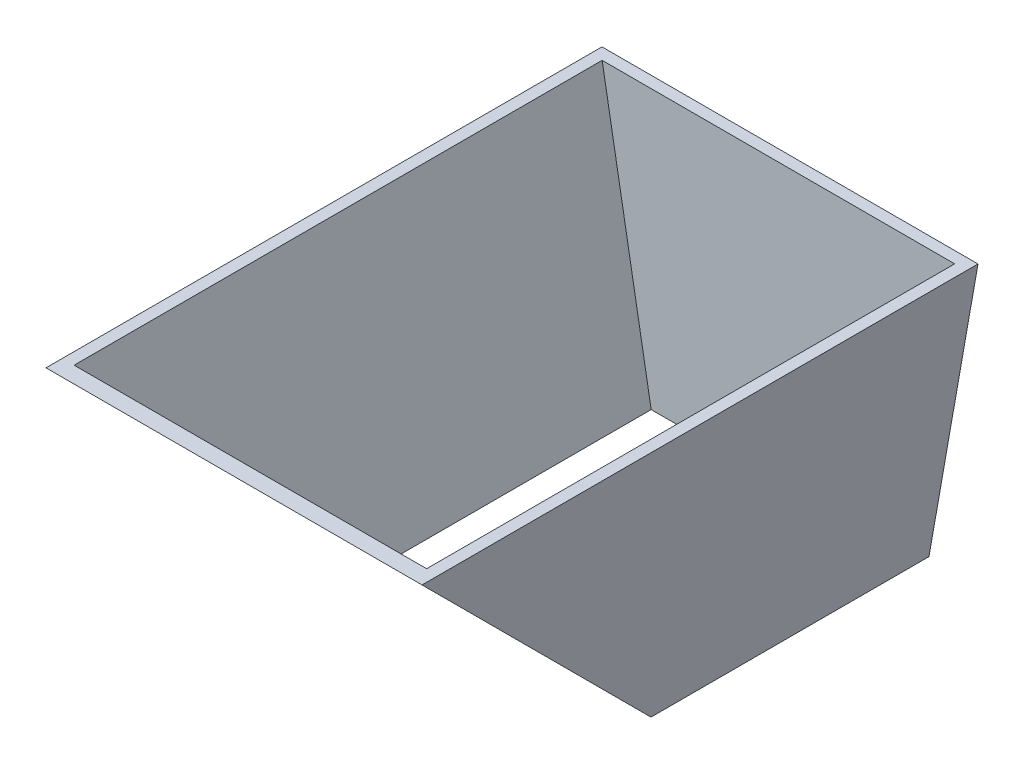
ISO-10303-21;
HEADER;
FILE_DESCRIPTION(('STEP AP214'),'2;1');
FILE_NAME('part.step','',(''),(''),'','','');
FILE_SCHEMA(('AUTOMOTIVE_DESIGN { 1 0 10303 214 1 1 1 1 }'));
ENDSEC;
DATA;
#1=APPLICATION_CONTEXT('core data for automotive mechanical design processes');
#2=APPLICATION_PROTOCOL_DEFINITION('international standard','automotive_design',2000,#1);
#3=PRODUCT_CONTEXT('',#1,'mechanical');
#4=PRODUCT('Part','Part','',(#3));
#5=PRODUCT_RELATED_PRODUCT_CATEGORY('part','',(#4));
#6=PRODUCT_DEFINITION_FORMATION('','',#4);
#7=PRODUCT_DEFINITION_CONTEXT('part definition',#1,'design');
#8=PRODUCT_DEFINITION('design','',#6,#7);
#9=PRODUCT_DEFINITION_SHAPE('','',#8);
#10=(LENGTH_UNIT() NAMED_UNIT(*) SI_UNIT(.MILLI.,.METRE.));
#11=(NAMED_UNIT(*) PLANE_ANGLE_UNIT() SI_UNIT($,.RADIAN.));
#12=(NAMED_UNIT(*) SI_UNIT($,.STERADIAN.) SOLID_ANGLE_UNIT());
#13=UNCERTAINTY_MEASURE_WITH_UNIT(LENGTH_MEASURE(1.E-05),#10,'distance_accuracy_value','');
#14=(GEOMETRIC_REPRESENTATION_CONTEXT(3) GLOBAL_UNCERTAINTY_ASSIGNED_CONTEXT((#13)) GLOBAL_UNIT_ASSIGNED_CONTEXT((#10,
#11,#12)) REPRESENTATION_CONTEXT('',''));
#15=CARTESIAN_POINT('',(0.,0.,0.));
#16=DIRECTION('',(0.,0.,1.));
#17=DIRECTION('',(1.,0.,0.));
#18=AXIS2_PLACEMENT_3D('',#15,#16,#17);
#19=CARTESIAN_POINT('',(-40.579618842508,30.,120.));
#20=DIRECTION('',(0.,-1.,0.));
#21=DIRECTION('',(0.,0.,-1.));
#22=AXIS2_PLACEMENT_3D('',#19,#20,#21);
#23=PLANE('',#22);
#24=DIRECTION('',(-1.,0.,0.));
#25=VECTOR('',#24,1.);
#26=CARTESIAN_POINT('',(-40.579618842508,30.,0.));
#27=LINE('',#26,#25);
#28=CARTESIAN_POINT('',(40.579618842508,30.,0.));
#29=VERTEX_POINT('',#28);
#30=CARTESIAN_POINT('',(-40.579618842508,30.,0.));
#31=VERTEX_POINT('',#30);
#32=EDGE_CURVE('E168',#29,#31,#27,.T.);
#33=ORIENTED_EDGE('',*,*,#32,.T.);
#34=DIRECTION('',(0.,0.,-1.));
#35=VECTOR('',#34,1.);
#36=CARTESIAN_POINT('',(-40.579618842508,30.,120.));
#37=LINE('',#36,#35);
#38=CARTESIAN_POINT('',(-40.579618842508,30.,120.));
#39=VERTEX_POINT('',#38);
#40=EDGE_CURVE('E48',#39,#31,#37,.T.);
#41=ORIENTED_EDGE('',*,*,#40,.F.);
#42=DIRECTION('',(-1.,0.,0.));
#43=VECTOR('',#42,1.);
#44=CARTESIAN_POINT('',(-40.579618842508,30.,120.));
#45=LINE('',#44,#43);
#46=CARTESIAN_POINT('',(40.579618842508,30.,120.));
#47=VERTEX_POINT('',#46);
#48=EDGE_CURVE('E160',#47,#39,#45,.T.);
#49=ORIENTED_EDGE('',*,*,#48,.F.);
#50=DIRECTION('',(0.,0.,-1.));
#51=VECTOR('',#50,1.);
#52=CARTESIAN_POINT('',(40.579618842508,30.,120.));
#53=LINE('',#52,#51);
#54=EDGE_CURVE('E11',#47,#29,#53,.T.);
#55=ORIENTED_EDGE('',*,*,#54,.T.);
#56=EDGE_LOOP('',(#33,#41,#49,#55));
#57=FACE_BOUND('',#56,.T.);
#58=DIRECTION('',(-1.,0.,0.));
#59=VECTOR('',#58,1.);
#60=CARTESIAN_POINT('',(0.,30.,2.5));
#61=LINE('',#60,#59);
#62=CARTESIAN_POINT('',(38.0410523127936,30.,2.5));
#63=VERTEX_POINT('',#62);
#64=CARTESIAN_POINT('',(-38.0410523127936,30.,2.5));
#65=VERTEX_POINT('',#64);
#66=EDGE_CURVE('E119',#63,#65,#61,.T.);
#67=ORIENTED_EDGE('',*,*,#66,.F.);
#68=DIRECTION('',(0.,0.,-1.));
#69=VECTOR('',#68,1.);
#70=CARTESIAN_POINT('',(38.0410523127936,30.,120.));
#71=LINE('',#70,#69);
#72=CARTESIAN_POINT('',(38.0410523127936,30.,116.464466094067));
#73=VERTEX_POINT('',#72);
#74=EDGE_CURVE('E105',#73,#63,#71,.T.);
#75=ORIENTED_EDGE('',*,*,#74,.F.);
#76=DIRECTION('',(-1.,0.,0.));
#77=VECTOR('',#76,1.);
#78=CARTESIAN_POINT('',(-40.579618842508,30.,116.464466094067));
#79=LINE('',#78,#77);
#80=CARTESIAN_POINT('',(-38.0410523127936,30.,116.464466094067));
#81=VERTEX_POINT('',#80);
#82=EDGE_CURVE('E55',#73,#81,#79,.T.);
#83=ORIENTED_EDGE('',*,*,#82,.T.);
#84=DIRECTION('',(0.,0.,-1.));
#85=VECTOR('',#84,1.);
#86=CARTESIAN_POINT('',(-38.0410523127936,30.,120.));
#87=LINE('',#86,#85);
#88=EDGE_CURVE('E116',#81,#65,#87,.T.);
#89=ORIENTED_EDGE('',*,*,#88,.T.);
#90=EDGE_LOOP('',(#67,#75,#83,#89));
#91=FACE_BOUND('',#90,.T.);
#92=ADVANCED_FACE('F39',(#57,#91),#23,.F.);
#93=CARTESIAN_POINT('',(40.579618842508,30.,120.));
#94=DIRECTION('',(-0.984807753012208,0.173648177666932,0.));
#95=DIRECTION('',(-0.173648177666932,-0.984807753012208,0.));
#96=AXIS2_PLACEMENT_3D('',#93,#94,#95);
#97=PLANE('',#96);
#98=ORIENTED_EDGE('',*,*,#54,.F.);
#99=DIRECTION('',(-0.123724030206485,-0.701673843159863,-0.701673843159863));
#100=VECTOR('',#99,1.);
#101=CARTESIAN_POINT('',(40.579618842508,30.,120.));
#102=LINE('',#101,#100);
#103=CARTESIAN_POINT('',(30.,-30.,60.));
#104=VERTEX_POINT('',#103);
#105=EDGE_CURVE('E155',#47,#104,#102,.T.);
#106=ORIENTED_EDGE('',*,*,#105,.T.);
#107=DIRECTION('',(0.,0.,-1.));
#108=VECTOR('',#107,1.);
#109=CARTESIAN_POINT('',(30.,-30.,120.));
#110=LINE('',#109,#108);
#111=CARTESIAN_POINT('',(30.,-30.,0.));
#112=VERTEX_POINT('',#111);
#113=EDGE_CURVE('E163',#104,#112,#110,.T.);
#114=ORIENTED_EDGE('',*,*,#113,.T.);
#115=DIRECTION('',(0.173648177666932,0.984807753012208,0.));
#116=VECTOR('',#115,1.);
#117=CARTESIAN_POINT('',(40.579618842508,30.,0.));
#118=LINE('',#117,#116);
#119=EDGE_CURVE('E159',#112,#29,#118,.T.);
#120=ORIENTED_EDGE('',*,*,#119,.T.);
#121=EDGE_LOOP('',(#98,#106,#114,#120));
#122=FACE_BOUND('',#121,.T.);
#123=ADVANCED_FACE('F41',(#122),#97,.F.);
#124=CARTESIAN_POINT('',(-30.,-30.,120.));
#125=DIRECTION('',(0.984807753012208,0.173648177666932,0.));
#126=DIRECTION('',(-0.173648177666932,0.984807753012208,0.));
#127=AXIS2_PLACEMENT_3D('',#124,#125,#126);
#128=PLANE('',#127);
#129=DIRECTION('',(0.,0.,-1.));
#130=VECTOR('',#129,1.);
#131=CARTESIAN_POINT('',(-30.,-30.,120.));
#132=LINE('',#131,#130);
#133=CARTESIAN_POINT('',(-30.,-30.,60.));
#134=VERTEX_POINT('',#133);
#135=CARTESIAN_POINT('',(-30.,-30.,0.));
#136=VERTEX_POINT('',#135);
#137=EDGE_CURVE('E180',#134,#136,#132,.T.);
#138=ORIENTED_EDGE('',*,*,#137,.F.);
#139=DIRECTION('',(-0.123724030206485,0.701673843159863,0.701673843159863));
#140=VECTOR('',#139,1.);
#141=CARTESIAN_POINT('',(-35.2088349459727,-0.459229069516051,89.5407709304839));
#142=LINE('',#141,#140);
#143=EDGE_CURVE('E151',#134,#39,#142,.T.);
#144=ORIENTED_EDGE('',*,*,#143,.T.);
#145=ORIENTED_EDGE('',*,*,#40,.T.);
#146=DIRECTION('',(0.173648177666932,-0.984807753012208,0.));
#147=VECTOR('',#146,1.);
#148=CARTESIAN_POINT('',(-30.,-30.,0.));
#149=LINE('',#148,#147);
#150=EDGE_CURVE('E171',#31,#136,#149,.T.);
#151=ORIENTED_EDGE('',*,*,#150,.T.);
#152=EDGE_LOOP('',(#138,#144,#145,#151));
#153=FACE_BOUND('',#152,.T.);
#154=ADVANCED_FACE('F188',(#153),#128,.F.);
#155=CARTESIAN_POINT('',(30.,-30.,120.));
#156=DIRECTION('',(0.,1.,0.));
#157=DIRECTION('',(0.,0.,1.));
#158=AXIS2_PLACEMENT_3D('',#155,#156,#157);
#159=PLANE('',#158);
#160=DIRECTION('',(1.,0.,0.));
#161=VECTOR('',#160,1.);
#162=CARTESIAN_POINT('',(-40.579618842508,-30.,56.4644660940673));
#163=LINE('',#162,#161);
#164=CARTESIAN_POINT('',(-27.4614334702856,-30.,56.4644660940673));
#165=VERTEX_POINT('',#164);
#166=CARTESIAN_POINT('',(27.4614334702856,-30.,56.4644660940673));
#167=VERTEX_POINT('',#166);
#168=EDGE_CURVE('E140',#165,#167,#163,.T.);
#169=ORIENTED_EDGE('',*,*,#168,.T.);
#170=DIRECTION('',(0.,0.,-1.));
#171=VECTOR('',#170,1.);
#172=CARTESIAN_POINT('',(27.4614334702856,-30.,120.));
#173=LINE('',#172,#171);
#174=CARTESIAN_POINT('',(27.4614334702856,-30.,2.5));
#175=VERTEX_POINT('',#174);
#176=EDGE_CURVE('E137',#167,#175,#173,.T.);
#177=ORIENTED_EDGE('',*,*,#176,.T.);
#178=DIRECTION('',(1.,0.,0.));
#179=VECTOR('',#178,1.);
#180=CARTESIAN_POINT('',(0.,-30.,2.5));
#181=LINE('',#180,#179);
#182=CARTESIAN_POINT('',(-27.4614334702856,-30.,2.5));
#183=VERTEX_POINT('',#182);
#184=EDGE_CURVE('E121',#183,#175,#181,.T.);
#185=ORIENTED_EDGE('',*,*,#184,.F.);
#186=DIRECTION('',(0.,0.,-1.));
#187=VECTOR('',#186,1.);
#188=CARTESIAN_POINT('',(-27.4614334702856,-30.,120.));
#189=LINE('',#188,#187);
#190=EDGE_CURVE('E134',#165,#183,#189,.T.);
#191=ORIENTED_EDGE('',*,*,#190,.F.);
#192=EDGE_LOOP('',(#169,#177,#185,#191));
#193=FACE_BOUND('',#192,.T.);
#194=ORIENTED_EDGE('',*,*,#113,.F.);
#195=DIRECTION('',(1.,0.,0.));
#196=VECTOR('',#195,1.);
#197=CARTESIAN_POINT('',(-40.579618842508,-30.,60.));
#198=LINE('',#197,#196);
#199=EDGE_CURVE('E115',#134,#104,#198,.T.);
#200=ORIENTED_EDGE('',*,*,#199,.F.);
#201=ORIENTED_EDGE('',*,*,#137,.T.);
#202=DIRECTION('',(1.,0.,0.));
#203=VECTOR('',#202,1.);
#204=CARTESIAN_POINT('',(30.,-30.,0.));
#205=LINE('',#204,#203);
#206=EDGE_CURVE('E164',#136,#112,#205,.T.);
#207=ORIENTED_EDGE('',*,*,#206,.T.);
#208=EDGE_LOOP('',(#194,#200,#201,#207));
#209=FACE_BOUND('',#208,.T.);
#210=ADVANCED_FACE('F197',(#193,#209),#159,.F.);
#211=CARTESIAN_POINT('',(0.,0.,0.));
#212=DIRECTION('',(0.,0.,-1.));
#213=DIRECTION('',(-1.,0.,0.));
#214=AXIS2_PLACEMENT_3D('',#211,#212,#213);
#215=PLANE('',#214);
#216=ORIENTED_EDGE('',*,*,#119,.F.);
#217=ORIENTED_EDGE('',*,*,#206,.F.);
#218=ORIENTED_EDGE('',*,*,#150,.F.);
#219=ORIENTED_EDGE('',*,*,#32,.F.);
#220=EDGE_LOOP('',(#216,#217,#218,#219));
#221=FACE_BOUND('',#220,.T.);
#222=ADVANCED_FACE('F194',(#221),#215,.T.);
#223=CARTESIAN_POINT('',(-40.579618842508,-30.,60.));
#224=DIRECTION('',(0.,0.707106781186547,-0.707106781186547));
#225=DIRECTION('',(0.,0.707106781186548,0.707106781186548));
#226=AXIS2_PLACEMENT_3D('',#223,#224,#225);
#227=PLANE('',#226);
#228=ORIENTED_EDGE('',*,*,#48,.T.);
#229=ORIENTED_EDGE('',*,*,#143,.F.);
#230=ORIENTED_EDGE('',*,*,#199,.T.);
#231=ORIENTED_EDGE('',*,*,#105,.F.);
#232=EDGE_LOOP('',(#228,#229,#230,#231));
#233=FACE_BOUND('',#232,.T.);
#234=ADVANCED_FACE('F200',(#233),#227,.F.);
#235=CARTESIAN_POINT('',(38.1175994599775,30.4341204441673,120.));
#236=DIRECTION('',(-0.984807753012208,0.173648177666932,0.));
#237=DIRECTION('',(-0.173648177666932,-0.984807753012208,0.));
#238=AXIS2_PLACEMENT_3D('',#235,#236,#237);
#239=PLANE('',#238);
#240=ORIENTED_EDGE('',*,*,#74,.T.);
#241=DIRECTION('',(0.173648177666932,0.984807753012208,0.));
#242=VECTOR('',#241,1.);
#243=CARTESIAN_POINT('',(31.7636720791432,-5.60079239392913,2.5));
#244=LINE('',#243,#242);
#245=EDGE_CURVE('E109',#175,#63,#244,.T.);
#246=ORIENTED_EDGE('',*,*,#245,.F.);
#247=ORIENTED_EDGE('',*,*,#176,.F.);
#248=DIRECTION('',(-0.123724030206485,-0.701673843159863,-0.701673843159863));
#249=VECTOR('',#248,1.);
#250=CARTESIAN_POINT('',(38.3868453070034,31.9610895214128,118.42555561548));
#251=LINE('',#250,#249);
#252=EDGE_CURVE('E111',#73,#167,#251,.T.);
#253=ORIENTED_EDGE('',*,*,#252,.F.);
#254=EDGE_LOOP('',(#240,#246,#247,#253));
#255=FACE_BOUND('',#254,.T.);
#256=ADVANCED_FACE('F107',(#255),#239,.T.);
#257=CARTESIAN_POINT('',(-27.5379806174695,-29.5658795558327,120.));
#258=DIRECTION('',(0.984807753012208,0.173648177666932,0.));
#259=DIRECTION('',(-0.173648177666932,0.984807753012208,0.));
#260=AXIS2_PLACEMENT_3D('',#257,#258,#259);
#261=PLANE('',#260);
#262=ORIENTED_EDGE('',*,*,#190,.T.);
#263=DIRECTION('',(0.173648177666932,-0.984807753012208,0.));
#264=VECTOR('',#263,1.);
#265=CARTESIAN_POINT('',(-31.7636720791432,-5.60079239392913,2.5));
#266=LINE('',#265,#264);
#267=EDGE_CURVE('E63',#65,#183,#266,.T.);
#268=ORIENTED_EDGE('',*,*,#267,.F.);
#269=ORIENTED_EDGE('',*,*,#88,.F.);
#270=DIRECTION('',(-0.123724030206485,0.701673843159863,0.701673843159863));
#271=VECTOR('',#270,1.);
#272=CARTESIAN_POINT('',(-33.016061410468,1.5018604518968,87.9663265459641));
#273=LINE('',#272,#271);
#274=EDGE_CURVE('E144',#165,#81,#273,.T.);
#275=ORIENTED_EDGE('',*,*,#274,.F.);
#276=EDGE_LOOP('',(#262,#268,#269,#275));
#277=FACE_BOUND('',#276,.T.);
#278=ADVANCED_FACE('F222',(#277),#261,.T.);
#279=CARTESIAN_POINT('',(0.,0.,2.5));
#280=DIRECTION('',(0.,0.,-1.));
#281=DIRECTION('',(-1.,0.,0.));
#282=AXIS2_PLACEMENT_3D('',#279,#280,#281);
#283=PLANE('',#282);
#284=ORIENTED_EDGE('',*,*,#245,.T.);
#285=ORIENTED_EDGE('',*,*,#66,.T.);
#286=ORIENTED_EDGE('',*,*,#267,.T.);
#287=ORIENTED_EDGE('',*,*,#184,.T.);
#288=EDGE_LOOP('',(#284,#285,#286,#287));
#289=FACE_BOUND('',#288,.T.);
#290=ADVANCED_FACE('F118',(#289),#283,.F.);
#291=CARTESIAN_POINT('',(-40.579618842508,-28.2322330470336,58.2322330470336));
#292=DIRECTION('',(0.,0.707106781186547,-0.707106781186547));
#293=DIRECTION('',(0.,0.707106781186548,0.707106781186548));
#294=AXIS2_PLACEMENT_3D('',#291,#292,#293);
#295=PLANE('',#294);
#296=ORIENTED_EDGE('',*,*,#82,.F.);
#297=ORIENTED_EDGE('',*,*,#252,.T.);
#298=ORIENTED_EDGE('',*,*,#168,.F.);
#299=ORIENTED_EDGE('',*,*,#274,.T.);
#300=EDGE_LOOP('',(#296,#297,#298,#299));
#301=FACE_BOUND('',#300,.T.);
#302=ADVANCED_FACE('F217',(#301),#295,.T.);
#303=CLOSED_SHELL('',(#92,#123,#154,#210,#222,#234,#256,#278,#290,#302));
#304=MANIFOLD_SOLID_BREP('B2',#303);
#305=ADVANCED_BREP_SHAPE_REPRESENTATION('',(#18,#304),#14);
#306=SHAPE_DEFINITION_REPRESENTATION(#9,#305);
ENDSEC;
END-ISO-10303-21;
